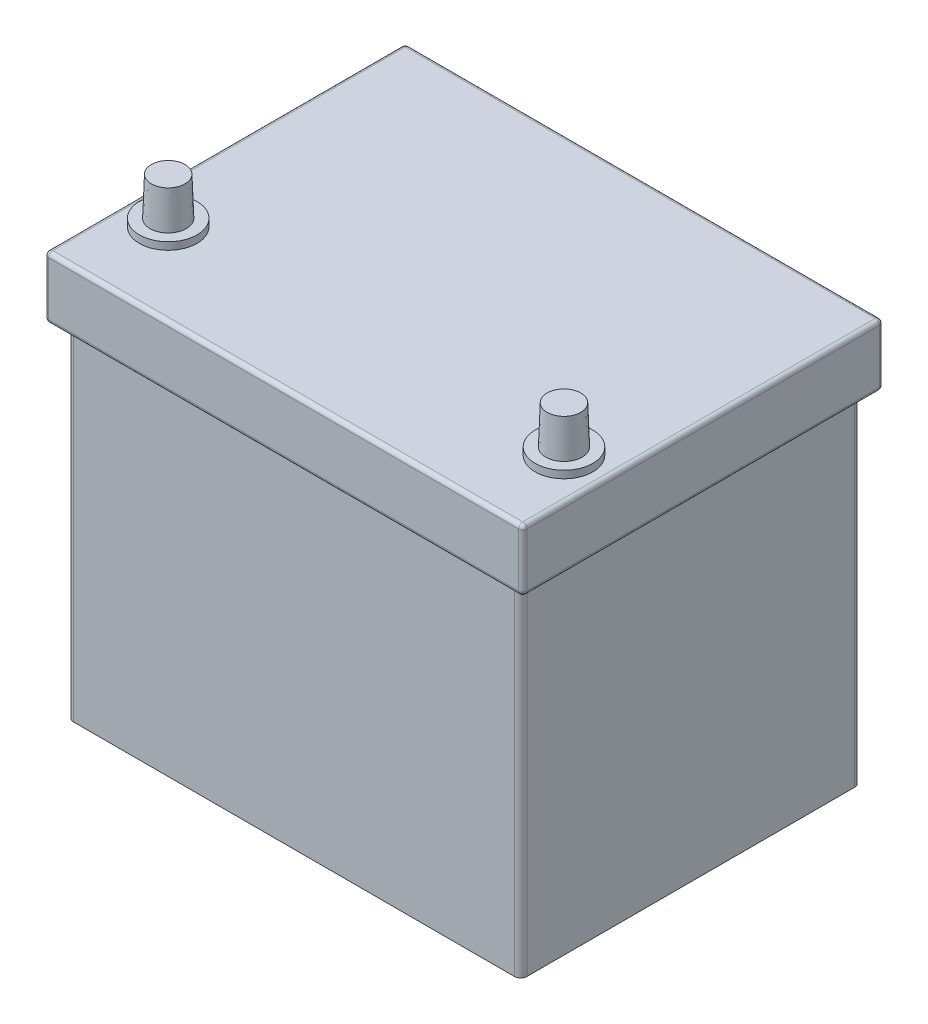
ISO-10303-21;
HEADER;
FILE_DESCRIPTION(('STEP AP214'),'2;1');
FILE_NAME('part.step','',(''),(''),'','','');
FILE_SCHEMA(('AUTOMOTIVE_DESIGN { 1 0 10303 214 1 1 1 1 }'));
ENDSEC;
DATA;
#1=APPLICATION_CONTEXT('core data for automotive mechanical design processes');
#2=APPLICATION_PROTOCOL_DEFINITION('international standard','automotive_design',2000,#1);
#3=PRODUCT_CONTEXT('',#1,'mechanical');
#4=PRODUCT('Part','Part','',(#3));
#5=PRODUCT_RELATED_PRODUCT_CATEGORY('part','',(#4));
#6=PRODUCT_DEFINITION_FORMATION('','',#4);
#7=PRODUCT_DEFINITION_CONTEXT('part definition',#1,'design');
#8=PRODUCT_DEFINITION('design','',#6,#7);
#9=PRODUCT_DEFINITION_SHAPE('','',#8);
#10=(LENGTH_UNIT() NAMED_UNIT(*) SI_UNIT(.MILLI.,.METRE.));
#11=(NAMED_UNIT(*) PLANE_ANGLE_UNIT() SI_UNIT($,.RADIAN.));
#12=(NAMED_UNIT(*) SI_UNIT($,.STERADIAN.) SOLID_ANGLE_UNIT());
#13=UNCERTAINTY_MEASURE_WITH_UNIT(LENGTH_MEASURE(1.E-05),#10,'distance_accuracy_value','');
#14=(GEOMETRIC_REPRESENTATION_CONTEXT(3) GLOBAL_UNCERTAINTY_ASSIGNED_CONTEXT((#13)) GLOBAL_UNIT_ASSIGNED_CONTEXT((#10,
#11,#12)) REPRESENTATION_CONTEXT('',''));
#15=CARTESIAN_POINT('',(0.,0.,0.));
#16=DIRECTION('',(0.,0.,1.));
#17=DIRECTION('',(1.,0.,0.));
#18=AXIS2_PLACEMENT_3D('',#15,#16,#17);
#19=CARTESIAN_POINT('',(-96.0000000000003,199.6,47.4999999999997));
#20=DIRECTION('',(0.,-1.,0.));
#21=DIRECTION('',(0.,0.,-1.));
#22=AXIS2_PLACEMENT_3D('',#19,#20,#21);
#23=PLANE('',#22);
#24=CARTESIAN_POINT('',(-96.0000000000003,199.6,47.4999999999997));
#25=DIRECTION('',(0.,1.,0.));
#26=DIRECTION('',(0.,0.,-1.));
#27=AXIS2_PLACEMENT_3D('',#24,#25,#26);
#28=CIRCLE('',#27,14.);
#29=CARTESIAN_POINT('',(-96.0000000000003,199.6,33.4999999999997));
#30=VERTEX_POINT('',#29);
#31=EDGE_CURVE('E389',#30,#30,#28,.T.);
#32=ORIENTED_EDGE('',*,*,#31,.T.);
#33=EDGE_LOOP('',(#32));
#34=FACE_BOUND('',#33,.T.);
#35=CARTESIAN_POINT('',(-96.0000000000003,199.6,47.4999999999997));
#36=DIRECTION('',(0.,-1.,0.));
#37=DIRECTION('',(0.,0.,-1.));
#38=AXIS2_PLACEMENT_3D('',#35,#36,#37);
#39=CIRCLE('',#38,8.80000000000001);
#40=CARTESIAN_POINT('',(-96.0000000000003,199.6,38.6999999999997));
#41=VERTEX_POINT('',#40);
#42=EDGE_CURVE('E12',#41,#41,#39,.F.);
#43=ORIENTED_EDGE('',*,*,#42,.F.);
#44=EDGE_LOOP('',(#43));
#45=FACE_BOUND('',#44,.T.);
#46=ADVANCED_FACE('F36',(#34,#45),#23,.F.);
#47=CARTESIAN_POINT('',(96.0000000000003,199.6,47.4999999999997));
#48=DIRECTION('',(0.,1.,0.));
#49=DIRECTION('',(0.,0.,1.));
#50=AXIS2_PLACEMENT_3D('',#47,#48,#49);
#51=PLANE('',#50);
#52=CARTESIAN_POINT('',(96.0000000000003,199.6,47.4999999999997));
#53=DIRECTION('',(0.,1.,0.));
#54=DIRECTION('',(0.,0.,1.));
#55=AXIS2_PLACEMENT_3D('',#52,#53,#54);
#56=CIRCLE('',#55,14.);
#57=CARTESIAN_POINT('',(96.0000000000003,199.6,61.4999999999997));
#58=VERTEX_POINT('',#57);
#59=EDGE_CURVE('E269',#58,#58,#56,.T.);
#60=ORIENTED_EDGE('',*,*,#59,.T.);
#61=EDGE_LOOP('',(#60));
#62=FACE_BOUND('',#61,.T.);
#63=CARTESIAN_POINT('',(96.0000000000003,199.6,47.4999999999997));
#64=DIRECTION('',(0.,1.,0.));
#65=DIRECTION('',(0.,0.,1.));
#66=AXIS2_PLACEMENT_3D('',#63,#64,#65);
#67=CIRCLE('',#66,8.80000000000001);
#68=CARTESIAN_POINT('',(96.0000000000003,199.6,56.2999999999997));
#69=VERTEX_POINT('',#68);
#70=EDGE_CURVE('E400',#69,#69,#67,.T.);
#71=ORIENTED_EDGE('',*,*,#70,.F.);
#72=EDGE_LOOP('',(#71));
#73=FACE_BOUND('',#72,.T.);
#74=ADVANCED_FACE('F417',(#62,#73),#51,.T.);
#75=CARTESIAN_POINT('',(116.,196.,87.4999999999997));
#76=DIRECTION('',(0.,1.,0.));
#77=DIRECTION('',(0.,0.,1.));
#78=AXIS2_PLACEMENT_3D('',#75,#76,#77);
#79=PLANE('',#78);
#80=CARTESIAN_POINT('',(96.0000000000003,196.,47.4999999999997));
#81=DIRECTION('',(0.,1.,0.));
#82=DIRECTION('',(0.,0.,1.));
#83=AXIS2_PLACEMENT_3D('',#80,#81,#82);
#84=CIRCLE('',#83,14.);
#85=CARTESIAN_POINT('',(96.0000000000003,196.,61.4999999999997));
#86=VERTEX_POINT('',#85);
#87=EDGE_CURVE('E386',#86,#86,#84,.T.);
#88=ORIENTED_EDGE('',*,*,#87,.F.);
#89=EDGE_LOOP('',(#88));
#90=FACE_BOUND('',#89,.T.);
#91=DIRECTION('',(0.,0.,1.));
#92=VECTOR('',#91,1.);
#93=CARTESIAN_POINT('',(-114.,196.,87.4999999999997));
#94=LINE('',#93,#92);
#95=CARTESIAN_POINT('',(-114.,196.,-85.5000000000005));
#96=VERTEX_POINT('',#95);
#97=CARTESIAN_POINT('',(-114.,196.,85.4999999999997));
#98=VERTEX_POINT('',#97);
#99=EDGE_CURVE('E238',#96,#98,#94,.T.);
#100=ORIENTED_EDGE('',*,*,#99,.T.);
#101=DIRECTION('',(1.,0.,0.));
#102=VECTOR('',#101,1.);
#103=CARTESIAN_POINT('',(116.,196.,85.4999999999997));
#104=LINE('',#103,#102);
#105=CARTESIAN_POINT('',(114.,196.,85.4999999999997));
#106=VERTEX_POINT('',#105);
#107=EDGE_CURVE('E240',#98,#106,#104,.T.);
#108=ORIENTED_EDGE('',*,*,#107,.T.);
#109=DIRECTION('',(0.,0.,-1.));
#110=VECTOR('',#109,1.);
#111=CARTESIAN_POINT('',(114.,196.,-87.5000000000005));
#112=LINE('',#111,#110);
#113=CARTESIAN_POINT('',(114.,196.,-85.5000000000005));
#114=VERTEX_POINT('',#113);
#115=EDGE_CURVE('E234',#106,#114,#112,.T.);
#116=ORIENTED_EDGE('',*,*,#115,.T.);
#117=DIRECTION('',(-1.,0.,0.));
#118=VECTOR('',#117,1.);
#119=CARTESIAN_POINT('',(-116.,196.,-85.5000000000005));
#120=LINE('',#119,#118);
#121=EDGE_CURVE('E236',#114,#96,#120,.T.);
#122=ORIENTED_EDGE('',*,*,#121,.T.);
#123=EDGE_LOOP('',(#100,#108,#116,#122));
#124=FACE_BOUND('',#123,.T.);
#125=CARTESIAN_POINT('',(-96.0000000000003,196.,47.4999999999997));
#126=DIRECTION('',(0.,1.,0.));
#127=DIRECTION('',(0.,0.,-1.));
#128=AXIS2_PLACEMENT_3D('',#125,#126,#127);
#129=CIRCLE('',#128,14.);
#130=CARTESIAN_POINT('',(-96.0000000000003,196.,33.4999999999997));
#131=VERTEX_POINT('',#130);
#132=EDGE_CURVE('E392',#131,#131,#129,.T.);
#133=ORIENTED_EDGE('',*,*,#132,.F.);
#134=EDGE_LOOP('',(#133));
#135=FACE_BOUND('',#134,.T.);
#136=ADVANCED_FACE('F423',(#90,#124,#135),#79,.T.);
#137=CARTESIAN_POINT('',(110.,166.,-82.5));
#138=DIRECTION('',(-1.,0.,0.));
#139=DIRECTION('',(0.,0.,1.));
#140=AXIS2_PLACEMENT_3D('',#137,#138,#139);
#141=PLANE('',#140);
#142=DIRECTION('',(0.,0.,-1.));
#143=VECTOR('',#142,1.);
#144=CARTESIAN_POINT('',(110.,0.,-82.5));
#145=LINE('',#144,#143);
#146=CARTESIAN_POINT('',(110.,0.,79.5));
#147=VERTEX_POINT('',#146);
#148=CARTESIAN_POINT('',(110.,0.,-79.5));
#149=VERTEX_POINT('',#148);
#150=EDGE_CURVE('E332',#147,#149,#145,.T.);
#151=ORIENTED_EDGE('',*,*,#150,.T.);
#152=DIRECTION('',(0.,-1.,0.));
#153=VECTOR('',#152,1.);
#154=CARTESIAN_POINT('',(110.,166.,-79.5));
#155=LINE('',#154,#153);
#156=CARTESIAN_POINT('',(110.,166.,-79.5));
#157=VERTEX_POINT('',#156);
#158=EDGE_CURVE('E184',#149,#157,#155,.F.);
#159=ORIENTED_EDGE('',*,*,#158,.T.);
#160=DIRECTION('',(0.,0.,-1.));
#161=VECTOR('',#160,1.);
#162=CARTESIAN_POINT('',(110.,166.,-82.5));
#163=LINE('',#162,#161);
#164=CARTESIAN_POINT('',(110.,166.,79.5));
#165=VERTEX_POINT('',#164);
#166=EDGE_CURVE('E352',#165,#157,#163,.T.);
#167=ORIENTED_EDGE('',*,*,#166,.F.);
#168=DIRECTION('',(0.,-1.,0.));
#169=VECTOR('',#168,1.);
#170=CARTESIAN_POINT('',(110.,166.,79.5));
#171=LINE('',#170,#169);
#172=EDGE_CURVE('E211',#165,#147,#171,.T.);
#173=ORIENTED_EDGE('',*,*,#172,.T.);
#174=EDGE_LOOP('',(#151,#159,#167,#173));
#175=FACE_BOUND('',#174,.T.);
#176=ADVANCED_FACE('F441',(#175),#141,.F.);
#177=CARTESIAN_POINT('',(-110.,166.,-82.5));
#178=DIRECTION('',(0.,0.,1.));
#179=DIRECTION('',(1.,0.,0.));
#180=AXIS2_PLACEMENT_3D('',#177,#178,#179);
#181=PLANE('',#180);
#182=DIRECTION('',(-1.,0.,0.));
#183=VECTOR('',#182,1.);
#184=CARTESIAN_POINT('',(-110.,0.,-82.5));
#185=LINE('',#184,#183);
#186=CARTESIAN_POINT('',(107.,0.,-82.5));
#187=VERTEX_POINT('',#186);
#188=CARTESIAN_POINT('',(-107.,0.,-82.5));
#189=VERTEX_POINT('',#188);
#190=EDGE_CURVE('E338',#187,#189,#185,.T.);
#191=ORIENTED_EDGE('',*,*,#190,.T.);
#192=DIRECTION('',(0.,-1.,0.));
#193=VECTOR('',#192,1.);
#194=CARTESIAN_POINT('',(-107.,166.,-82.5));
#195=LINE('',#194,#193);
#196=CARTESIAN_POINT('',(-107.,166.,-82.5));
#197=VERTEX_POINT('',#196);
#198=EDGE_CURVE('E200',#189,#197,#195,.F.);
#199=ORIENTED_EDGE('',*,*,#198,.T.);
#200=DIRECTION('',(-1.,0.,0.));
#201=VECTOR('',#200,1.);
#202=CARTESIAN_POINT('',(-110.,166.,-82.5));
#203=LINE('',#202,#201);
#204=CARTESIAN_POINT('',(107.,166.,-82.5));
#205=VERTEX_POINT('',#204);
#206=EDGE_CURVE('E370',#205,#197,#203,.T.);
#207=ORIENTED_EDGE('',*,*,#206,.F.);
#208=DIRECTION('',(0.,-1.,0.));
#209=VECTOR('',#208,1.);
#210=CARTESIAN_POINT('',(107.,166.,-82.5));
#211=LINE('',#210,#209);
#212=EDGE_CURVE('E204',#205,#187,#211,.T.);
#213=ORIENTED_EDGE('',*,*,#212,.T.);
#214=EDGE_LOOP('',(#191,#199,#207,#213));
#215=FACE_BOUND('',#214,.T.);
#216=ADVANCED_FACE('F367',(#215),#181,.F.);
#217=CARTESIAN_POINT('',(-110.,166.,-82.5));
#218=DIRECTION('',(1.,0.,0.));
#219=DIRECTION('',(0.,0.,-1.));
#220=AXIS2_PLACEMENT_3D('',#217,#218,#219);
#221=PLANE('',#220);
#222=DIRECTION('',(0.,0.,1.));
#223=VECTOR('',#222,1.);
#224=CARTESIAN_POINT('',(-110.,166.,-82.5));
#225=LINE('',#224,#223);
#226=CARTESIAN_POINT('',(-110.,166.,-79.5));
#227=VERTEX_POINT('',#226);
#228=CARTESIAN_POINT('',(-110.,166.,79.5));
#229=VERTEX_POINT('',#228);
#230=EDGE_CURVE('E194',#227,#229,#225,.T.);
#231=ORIENTED_EDGE('',*,*,#230,.F.);
#232=DIRECTION('',(0.,-1.,0.));
#233=VECTOR('',#232,1.);
#234=CARTESIAN_POINT('',(-110.,166.,-79.5));
#235=LINE('',#234,#233);
#236=CARTESIAN_POINT('',(-110.,0.,-79.5));
#237=VERTEX_POINT('',#236);
#238=EDGE_CURVE('E354',#227,#237,#235,.T.);
#239=ORIENTED_EDGE('',*,*,#238,.T.);
#240=DIRECTION('',(0.,0.,1.));
#241=VECTOR('',#240,1.);
#242=CARTESIAN_POINT('',(-110.,0.,-82.5));
#243=LINE('',#242,#241);
#244=CARTESIAN_POINT('',(-110.,0.,79.5));
#245=VERTEX_POINT('',#244);
#246=EDGE_CURVE('E344',#237,#245,#243,.T.);
#247=ORIENTED_EDGE('',*,*,#246,.T.);
#248=DIRECTION('',(0.,-1.,0.));
#249=VECTOR('',#248,1.);
#250=CARTESIAN_POINT('',(-110.,166.,79.5));
#251=LINE('',#250,#249);
#252=EDGE_CURVE('E193',#245,#229,#251,.F.);
#253=ORIENTED_EDGE('',*,*,#252,.T.);
#254=EDGE_LOOP('',(#231,#239,#247,#253));
#255=FACE_BOUND('',#254,.T.);
#256=ADVANCED_FACE('F381',(#255),#221,.F.);
#257=CARTESIAN_POINT('',(-110.,166.,82.5));
#258=DIRECTION('',(0.,0.,-1.));
#259=DIRECTION('',(-1.,0.,0.));
#260=AXIS2_PLACEMENT_3D('',#257,#258,#259);
#261=PLANE('',#260);
#262=DIRECTION('',(1.,0.,0.));
#263=VECTOR('',#262,1.);
#264=CARTESIAN_POINT('',(-110.,0.,82.5));
#265=LINE('',#264,#263);
#266=CARTESIAN_POINT('',(-107.,0.,82.5));
#267=VERTEX_POINT('',#266);
#268=CARTESIAN_POINT('',(107.,0.,82.5));
#269=VERTEX_POINT('',#268);
#270=EDGE_CURVE('E350',#267,#269,#265,.T.);
#271=ORIENTED_EDGE('',*,*,#270,.T.);
#272=DIRECTION('',(0.,-1.,0.));
#273=VECTOR('',#272,1.);
#274=CARTESIAN_POINT('',(107.,166.,82.5));
#275=LINE('',#274,#273);
#276=CARTESIAN_POINT('',(107.,166.,82.5));
#277=VERTEX_POINT('',#276);
#278=EDGE_CURVE('E183',#269,#277,#275,.F.);
#279=ORIENTED_EDGE('',*,*,#278,.T.);
#280=DIRECTION('',(1.,0.,0.));
#281=VECTOR('',#280,1.);
#282=CARTESIAN_POINT('',(-110.,166.,82.5));
#283=LINE('',#282,#281);
#284=CARTESIAN_POINT('',(-107.,166.,82.5));
#285=VERTEX_POINT('',#284);
#286=EDGE_CURVE('E187',#285,#277,#283,.T.);
#287=ORIENTED_EDGE('',*,*,#286,.F.);
#288=DIRECTION('',(0.,-1.,0.));
#289=VECTOR('',#288,1.);
#290=CARTESIAN_POINT('',(-107.,166.,82.5));
#291=LINE('',#290,#289);
#292=EDGE_CURVE('E172',#285,#267,#291,.T.);
#293=ORIENTED_EDGE('',*,*,#292,.T.);
#294=EDGE_LOOP('',(#271,#279,#287,#293));
#295=FACE_BOUND('',#294,.T.);
#296=ADVANCED_FACE('F188',(#295),#261,.F.);
#297=CARTESIAN_POINT('',(110.,0.,82.5));
#298=DIRECTION('',(0.,1.,0.));
#299=DIRECTION('',(0.,0.,1.));
#300=AXIS2_PLACEMENT_3D('',#297,#298,#299);
#301=PLANE('',#300);
#302=ORIENTED_EDGE('',*,*,#246,.F.);
#303=CARTESIAN_POINT('',(-107.,0.,-79.5));
#304=DIRECTION('',(0.,1.,0.));
#305=DIRECTION('',(0.,0.,1.));
#306=AXIS2_PLACEMENT_3D('',#303,#304,#305);
#307=CIRCLE('',#306,3.);
#308=EDGE_CURVE('E362',#237,#189,#307,.F.);
#309=ORIENTED_EDGE('',*,*,#308,.T.);
#310=ORIENTED_EDGE('',*,*,#190,.F.);
#311=CARTESIAN_POINT('',(107.,0.,-79.5));
#312=DIRECTION('',(0.,1.,0.));
#313=DIRECTION('',(0.,0.,1.));
#314=AXIS2_PLACEMENT_3D('',#311,#312,#313);
#315=CIRCLE('',#314,3.);
#316=EDGE_CURVE('E360',#187,#149,#315,.F.);
#317=ORIENTED_EDGE('',*,*,#316,.T.);
#318=ORIENTED_EDGE('',*,*,#150,.F.);
#319=CARTESIAN_POINT('',(107.,0.,79.5));
#320=DIRECTION('',(0.,1.,0.));
#321=DIRECTION('',(0.,0.,1.));
#322=AXIS2_PLACEMENT_3D('',#319,#320,#321);
#323=CIRCLE('',#322,3.);
#324=EDGE_CURVE('E358',#147,#269,#323,.F.);
#325=ORIENTED_EDGE('',*,*,#324,.T.);
#326=ORIENTED_EDGE('',*,*,#270,.F.);
#327=CARTESIAN_POINT('',(-107.,0.,79.5));
#328=DIRECTION('',(0.,1.,0.));
#329=DIRECTION('',(0.,0.,1.));
#330=AXIS2_PLACEMENT_3D('',#327,#328,#329);
#331=CIRCLE('',#330,3.);
#332=EDGE_CURVE('E179',#267,#245,#331,.F.);
#333=ORIENTED_EDGE('',*,*,#332,.T.);
#334=EDGE_LOOP('',(#302,#309,#310,#317,#318,#325,#326,#333));
#335=FACE_BOUND('',#334,.T.);
#336=ADVANCED_FACE('F375',(#335),#301,.F.);
#337=CARTESIAN_POINT('',(-107.,166.,-79.5));
#338=DIRECTION('',(0.,-1.,0.));
#339=DIRECTION('',(0.,0.,-1.));
#340=AXIS2_PLACEMENT_3D('',#337,#338,#339);
#341=CYLINDRICAL_SURFACE('',#340,3.);
#342=CARTESIAN_POINT('',(-107.,166.,-79.5));
#343=DIRECTION('',(0.,1.,0.));
#344=DIRECTION('',(0.,0.,1.));
#345=AXIS2_PLACEMENT_3D('',#342,#343,#344);
#346=CIRCLE('',#345,3.);
#347=EDGE_CURVE('E209',#197,#227,#346,.T.);
#348=ORIENTED_EDGE('',*,*,#347,.F.);
#349=ORIENTED_EDGE('',*,*,#198,.F.);
#350=ORIENTED_EDGE('',*,*,#308,.F.);
#351=ORIENTED_EDGE('',*,*,#238,.F.);
#352=EDGE_LOOP('',(#348,#349,#350,#351));
#353=FACE_BOUND('',#352,.T.);
#354=ADVANCED_FACE('F379',(#353),#341,.T.);
#355=CARTESIAN_POINT('',(107.,166.,-79.5));
#356=DIRECTION('',(0.,-1.,0.));
#357=DIRECTION('',(0.,0.,-1.));
#358=AXIS2_PLACEMENT_3D('',#355,#356,#357);
#359=CYLINDRICAL_SURFACE('',#358,3.);
#360=CARTESIAN_POINT('',(107.,166.,-79.5));
#361=DIRECTION('',(0.,1.,0.));
#362=DIRECTION('',(0.,0.,1.));
#363=AXIS2_PLACEMENT_3D('',#360,#361,#362);
#364=CIRCLE('',#363,3.);
#365=EDGE_CURVE('E202',#157,#205,#364,.T.);
#366=ORIENTED_EDGE('',*,*,#365,.F.);
#367=ORIENTED_EDGE('',*,*,#158,.F.);
#368=ORIENTED_EDGE('',*,*,#316,.F.);
#369=ORIENTED_EDGE('',*,*,#212,.F.);
#370=EDGE_LOOP('',(#366,#367,#368,#369));
#371=FACE_BOUND('',#370,.T.);
#372=ADVANCED_FACE('F473',(#371),#359,.T.);
#373=CARTESIAN_POINT('',(107.,166.,79.5));
#374=DIRECTION('',(0.,-1.,0.));
#375=DIRECTION('',(0.,0.,-1.));
#376=AXIS2_PLACEMENT_3D('',#373,#374,#375);
#377=CYLINDRICAL_SURFACE('',#376,3.);
#378=CARTESIAN_POINT('',(107.,166.,79.5));
#379=DIRECTION('',(0.,1.,0.));
#380=DIRECTION('',(0.,0.,1.));
#381=AXIS2_PLACEMENT_3D('',#378,#379,#380);
#382=CIRCLE('',#381,3.);
#383=EDGE_CURVE('E199',#277,#165,#382,.T.);
#384=ORIENTED_EDGE('',*,*,#383,.F.);
#385=ORIENTED_EDGE('',*,*,#278,.F.);
#386=ORIENTED_EDGE('',*,*,#324,.F.);
#387=ORIENTED_EDGE('',*,*,#172,.F.);
#388=EDGE_LOOP('',(#384,#385,#386,#387));
#389=FACE_BOUND('',#388,.T.);
#390=ADVANCED_FACE('F476',(#389),#377,.T.);
#391=CARTESIAN_POINT('',(-107.,166.,79.5));
#392=DIRECTION('',(0.,-1.,0.));
#393=DIRECTION('',(0.,0.,-1.));
#394=AXIS2_PLACEMENT_3D('',#391,#392,#393);
#395=CYLINDRICAL_SURFACE('',#394,3.);
#396=CARTESIAN_POINT('',(-107.,166.,79.5));
#397=DIRECTION('',(0.,1.,0.));
#398=DIRECTION('',(0.,0.,1.));
#399=AXIS2_PLACEMENT_3D('',#396,#397,#398);
#400=CIRCLE('',#399,3.);
#401=EDGE_CURVE('E177',#229,#285,#400,.T.);
#402=ORIENTED_EDGE('',*,*,#401,.F.);
#403=ORIENTED_EDGE('',*,*,#252,.F.);
#404=ORIENTED_EDGE('',*,*,#332,.F.);
#405=ORIENTED_EDGE('',*,*,#292,.F.);
#406=EDGE_LOOP('',(#402,#403,#404,#405));
#407=FACE_BOUND('',#406,.T.);
#408=ADVANCED_FACE('F174',(#407),#395,.T.);
#409=CARTESIAN_POINT('',(116.,196.,-87.5000000000005));
#410=DIRECTION('',(-1.,0.,0.));
#411=DIRECTION('',(0.,0.,1.));
#412=AXIS2_PLACEMENT_3D('',#409,#410,#411);
#413=PLANE('',#412);
#414=DIRECTION('',(0.,0.,-1.));
#415=VECTOR('',#414,1.);
#416=CARTESIAN_POINT('',(116.,194.,87.4999999999997));
#417=LINE('',#416,#415);
#418=CARTESIAN_POINT('',(116.,194.,-85.5000000000005));
#419=VERTEX_POINT('',#418);
#420=CARTESIAN_POINT('',(116.,194.,85.4999999999997));
#421=VERTEX_POINT('',#420);
#422=EDGE_CURVE('E220',#419,#421,#417,.F.);
#423=ORIENTED_EDGE('',*,*,#422,.T.);
#424=DIRECTION('',(0.,-1.,0.));
#425=VECTOR('',#424,1.);
#426=CARTESIAN_POINT('',(116.,196.,85.4999999999997));
#427=LINE('',#426,#425);
#428=CARTESIAN_POINT('',(116.,168.,85.4999999999997));
#429=VERTEX_POINT('',#428);
#430=EDGE_CURVE('E222',#421,#429,#427,.T.);
#431=ORIENTED_EDGE('',*,*,#430,.T.);
#432=DIRECTION('',(0.,0.,-1.));
#433=VECTOR('',#432,1.);
#434=CARTESIAN_POINT('',(116.,168.,-87.5000000000005));
#435=LINE('',#434,#433);
#436=CARTESIAN_POINT('',(116.,168.,-85.5000000000005));
#437=VERTEX_POINT('',#436);
#438=EDGE_CURVE('E216',#429,#437,#435,.T.);
#439=ORIENTED_EDGE('',*,*,#438,.T.);
#440=DIRECTION('',(0.,-1.,0.));
#441=VECTOR('',#440,1.);
#442=CARTESIAN_POINT('',(116.,196.,-85.5000000000005));
#443=LINE('',#442,#441);
#444=EDGE_CURVE('E218',#437,#419,#443,.F.);
#445=ORIENTED_EDGE('',*,*,#444,.T.);
#446=EDGE_LOOP('',(#423,#431,#439,#445));
#447=FACE_BOUND('',#446,.T.);
#448=ADVANCED_FACE('F456',(#447),#413,.F.);
#449=CARTESIAN_POINT('',(-116.,196.,-87.5000000000005));
#450=DIRECTION('',(0.,0.,1.));
#451=DIRECTION('',(1.,0.,0.));
#452=AXIS2_PLACEMENT_3D('',#449,#450,#451);
#453=PLANE('',#452);
#454=DIRECTION('',(-1.,0.,0.));
#455=VECTOR('',#454,1.);
#456=CARTESIAN_POINT('',(-116.,168.,-87.5000000000005));
#457=LINE('',#456,#455);
#458=CARTESIAN_POINT('',(114.,168.,-87.5000000000005));
#459=VERTEX_POINT('',#458);
#460=CARTESIAN_POINT('',(-114.,168.,-87.5000000000005));
#461=VERTEX_POINT('',#460);
#462=EDGE_CURVE('E252',#459,#461,#457,.T.);
#463=ORIENTED_EDGE('',*,*,#462,.T.);
#464=DIRECTION('',(0.,-1.,0.));
#465=VECTOR('',#464,1.);
#466=CARTESIAN_POINT('',(-114.,196.,-87.5000000000005));
#467=LINE('',#466,#465);
#468=CARTESIAN_POINT('',(-114.,194.,-87.5000000000005));
#469=VERTEX_POINT('',#468);
#470=EDGE_CURVE('E258',#461,#469,#467,.F.);
#471=ORIENTED_EDGE('',*,*,#470,.T.);
#472=DIRECTION('',(-1.,0.,0.));
#473=VECTOR('',#472,1.);
#474=CARTESIAN_POINT('',(116.,194.,-87.5000000000005));
#475=LINE('',#474,#473);
#476=CARTESIAN_POINT('',(114.,194.,-87.5000000000005));
#477=VERTEX_POINT('',#476);
#478=EDGE_CURVE('E256',#469,#477,#475,.F.);
#479=ORIENTED_EDGE('',*,*,#478,.T.);
#480=DIRECTION('',(0.,-1.,0.));
#481=VECTOR('',#480,1.);
#482=CARTESIAN_POINT('',(114.,196.,-87.5000000000005));
#483=LINE('',#482,#481);
#484=EDGE_CURVE('E254',#477,#459,#483,.T.);
#485=ORIENTED_EDGE('',*,*,#484,.T.);
#486=EDGE_LOOP('',(#463,#471,#479,#485));
#487=FACE_BOUND('',#486,.T.);
#488=ADVANCED_FACE('F452',(#487),#453,.F.);
#489=CARTESIAN_POINT('',(-116.,196.,-87.5000000000005));
#490=DIRECTION('',(1.,0.,0.));
#491=DIRECTION('',(0.,0.,-1.));
#492=AXIS2_PLACEMENT_3D('',#489,#490,#491);
#493=PLANE('',#492);
#494=DIRECTION('',(0.,0.,1.));
#495=VECTOR('',#494,1.);
#496=CARTESIAN_POINT('',(-116.,168.,-87.5000000000005));
#497=LINE('',#496,#495);
#498=CARTESIAN_POINT('',(-116.,168.,-85.5000000000005));
#499=VERTEX_POINT('',#498);
#500=CARTESIAN_POINT('',(-116.,168.,85.4999999999997));
#501=VERTEX_POINT('',#500);
#502=EDGE_CURVE('E243',#499,#501,#497,.T.);
#503=ORIENTED_EDGE('',*,*,#502,.T.);
#504=DIRECTION('',(0.,-1.,0.));
#505=VECTOR('',#504,1.);
#506=CARTESIAN_POINT('',(-116.,196.,85.4999999999997));
#507=LINE('',#506,#505);
#508=CARTESIAN_POINT('',(-116.,194.,85.4999999999997));
#509=VERTEX_POINT('',#508);
#510=EDGE_CURVE('E249',#501,#509,#507,.F.);
#511=ORIENTED_EDGE('',*,*,#510,.T.);
#512=DIRECTION('',(0.,0.,1.));
#513=VECTOR('',#512,1.);
#514=CARTESIAN_POINT('',(-116.,194.,-87.5000000000005));
#515=LINE('',#514,#513);
#516=CARTESIAN_POINT('',(-116.,194.,-85.5000000000005));
#517=VERTEX_POINT('',#516);
#518=EDGE_CURVE('E247',#509,#517,#515,.F.);
#519=ORIENTED_EDGE('',*,*,#518,.T.);
#520=DIRECTION('',(0.,-1.,0.));
#521=VECTOR('',#520,1.);
#522=CARTESIAN_POINT('',(-116.,196.,-85.5000000000005));
#523=LINE('',#522,#521);
#524=EDGE_CURVE('E245',#517,#499,#523,.T.);
#525=ORIENTED_EDGE('',*,*,#524,.T.);
#526=EDGE_LOOP('',(#503,#511,#519,#525));
#527=FACE_BOUND('',#526,.T.);
#528=ADVANCED_FACE('F448',(#527),#493,.F.);
#529=CARTESIAN_POINT('',(-116.,196.,87.4999999999997));
#530=DIRECTION('',(0.,0.,-1.));
#531=DIRECTION('',(-1.,0.,0.));
#532=AXIS2_PLACEMENT_3D('',#529,#530,#531);
#533=PLANE('',#532);
#534=DIRECTION('',(1.,0.,0.));
#535=VECTOR('',#534,1.);
#536=CARTESIAN_POINT('',(-116.,168.,87.4999999999997));
#537=LINE('',#536,#535);
#538=CARTESIAN_POINT('',(-114.,168.,87.4999999999997));
#539=VERTEX_POINT('',#538);
#540=CARTESIAN_POINT('',(114.,168.,87.4999999999997));
#541=VERTEX_POINT('',#540);
#542=EDGE_CURVE('E225',#539,#541,#537,.T.);
#543=ORIENTED_EDGE('',*,*,#542,.T.);
#544=DIRECTION('',(0.,-1.,0.));
#545=VECTOR('',#544,1.);
#546=CARTESIAN_POINT('',(114.,196.,87.4999999999997));
#547=LINE('',#546,#545);
#548=CARTESIAN_POINT('',(114.,194.,87.4999999999997));
#549=VERTEX_POINT('',#548);
#550=EDGE_CURVE('E231',#541,#549,#547,.F.);
#551=ORIENTED_EDGE('',*,*,#550,.T.);
#552=DIRECTION('',(1.,0.,0.));
#553=VECTOR('',#552,1.);
#554=CARTESIAN_POINT('',(-116.,194.,87.4999999999997));
#555=LINE('',#554,#553);
#556=CARTESIAN_POINT('',(-114.,194.,87.4999999999997));
#557=VERTEX_POINT('',#556);
#558=EDGE_CURVE('E229',#549,#557,#555,.F.);
#559=ORIENTED_EDGE('',*,*,#558,.T.);
#560=DIRECTION('',(0.,-1.,0.));
#561=VECTOR('',#560,1.);
#562=CARTESIAN_POINT('',(-114.,196.,87.4999999999997));
#563=LINE('',#562,#561);
#564=EDGE_CURVE('E227',#557,#539,#563,.T.);
#565=ORIENTED_EDGE('',*,*,#564,.T.);
#566=EDGE_LOOP('',(#543,#551,#559,#565));
#567=FACE_BOUND('',#566,.T.);
#568=ADVANCED_FACE('F445',(#567),#533,.F.);
#569=CARTESIAN_POINT('',(116.,166.,87.4999999999997));
#570=DIRECTION('',(0.,1.,0.));
#571=DIRECTION('',(0.,0.,1.));
#572=AXIS2_PLACEMENT_3D('',#569,#570,#571);
#573=PLANE('',#572);
#574=DIRECTION('',(0.,0.,1.));
#575=VECTOR('',#574,1.);
#576=CARTESIAN_POINT('',(-114.,166.,87.4999999999997));
#577=LINE('',#576,#575);
#578=CARTESIAN_POINT('',(-114.,166.,85.4999999999997));
#579=VERTEX_POINT('',#578);
#580=CARTESIAN_POINT('',(-114.,166.,-85.5000000000005));
#581=VERTEX_POINT('',#580);
#582=EDGE_CURVE('E51',#579,#581,#577,.F.);
#583=ORIENTED_EDGE('',*,*,#582,.T.);
#584=DIRECTION('',(-1.,0.,0.));
#585=VECTOR('',#584,1.);
#586=CARTESIAN_POINT('',(116.,166.,-85.5000000000005));
#587=LINE('',#586,#585);
#588=CARTESIAN_POINT('',(114.,166.,-85.5000000000005));
#589=VERTEX_POINT('',#588);
#590=EDGE_CURVE('E44',#581,#589,#587,.F.);
#591=ORIENTED_EDGE('',*,*,#590,.T.);
#592=DIRECTION('',(0.,0.,-1.));
#593=VECTOR('',#592,1.);
#594=CARTESIAN_POINT('',(114.,166.,87.4999999999997));
#595=LINE('',#594,#593);
#596=CARTESIAN_POINT('',(114.,166.,85.4999999999997));
#597=VERTEX_POINT('',#596);
#598=EDGE_CURVE('E261',#589,#597,#595,.F.);
#599=ORIENTED_EDGE('',*,*,#598,.T.);
#600=DIRECTION('',(1.,0.,0.));
#601=VECTOR('',#600,1.);
#602=CARTESIAN_POINT('',(116.,166.,85.4999999999997));
#603=LINE('',#602,#601);
#604=EDGE_CURVE('E56',#597,#579,#603,.F.);
#605=ORIENTED_EDGE('',*,*,#604,.T.);
#606=EDGE_LOOP('',(#583,#591,#599,#605));
#607=FACE_BOUND('',#606,.T.);
#608=ORIENTED_EDGE('',*,*,#365,.T.);
#609=ORIENTED_EDGE('',*,*,#206,.T.);
#610=ORIENTED_EDGE('',*,*,#347,.T.);
#611=ORIENTED_EDGE('',*,*,#230,.T.);
#612=ORIENTED_EDGE('',*,*,#401,.T.);
#613=ORIENTED_EDGE('',*,*,#286,.T.);
#614=ORIENTED_EDGE('',*,*,#383,.T.);
#615=ORIENTED_EDGE('',*,*,#166,.T.);
#616=EDGE_LOOP('',(#608,#609,#610,#611,#612,#613,#614,#615));
#617=FACE_BOUND('',#616,.T.);
#618=ADVANCED_FACE('F197',(#607,#617),#573,.F.);
#619=CARTESIAN_POINT('',(-114.,196.,-85.5000000000005));
#620=DIRECTION('',(0.,-1.,0.));
#621=DIRECTION('',(0.,0.,-1.));
#622=AXIS2_PLACEMENT_3D('',#619,#620,#621);
#623=CYLINDRICAL_SURFACE('',#622,2.);
#624=CARTESIAN_POINT('',(-114.,194.,-85.5000000000005));
#625=DIRECTION('',(0.,1.,0.));
#626=DIRECTION('',(0.,0.,1.));
#627=AXIS2_PLACEMENT_3D('',#624,#625,#626);
#628=CIRCLE('',#627,2.);
#629=EDGE_CURVE('E330',#469,#517,#628,.T.);
#630=ORIENTED_EDGE('',*,*,#629,.F.);
#631=ORIENTED_EDGE('',*,*,#470,.F.);
#632=CARTESIAN_POINT('',(-114.,168.,-85.5000000000005));
#633=DIRECTION('',(0.,-1.,0.));
#634=DIRECTION('',(0.,0.,-1.));
#635=AXIS2_PLACEMENT_3D('',#632,#633,#634);
#636=CIRCLE('',#635,2.);
#637=EDGE_CURVE('E328',#499,#461,#636,.T.);
#638=ORIENTED_EDGE('',*,*,#637,.F.);
#639=ORIENTED_EDGE('',*,*,#524,.F.);
#640=EDGE_LOOP('',(#630,#631,#638,#639));
#641=FACE_BOUND('',#640,.T.);
#642=ADVANCED_FACE('F38',(#641),#623,.T.);
#643=CARTESIAN_POINT('',(-114.,194.,-85.5000000000005));
#644=DIRECTION('',(0.,0.,1.));
#645=DIRECTION('',(1.,0.,0.));
#646=AXIS2_PLACEMENT_3D('',#643,#644,#645);
#647=SPHERICAL_SURFACE('',#646,2.);
#648=CARTESIAN_POINT('',(-114.,194.,-85.5000000000005));
#649=DIRECTION('',(-1.,0.,0.));
#650=DIRECTION('',(0.,0.,1.));
#651=AXIS2_PLACEMENT_3D('',#648,#649,#650);
#652=CIRCLE('',#651,2.);
#653=EDGE_CURVE('E322',#469,#96,#652,.F.);
#654=ORIENTED_EDGE('',*,*,#653,.F.);
#655=ORIENTED_EDGE('',*,*,#629,.T.);
#656=CARTESIAN_POINT('',(-114.,194.,-85.5000000000005));
#657=DIRECTION('',(0.,0.,-1.));
#658=DIRECTION('',(-1.,0.,0.));
#659=AXIS2_PLACEMENT_3D('',#656,#657,#658);
#660=CIRCLE('',#659,2.);
#661=EDGE_CURVE('E325',#96,#517,#660,.F.);
#662=ORIENTED_EDGE('',*,*,#661,.F.);
#663=EDGE_LOOP('',(#654,#655,#662));
#664=FACE_BOUND('',#663,.T.);
#665=ADVANCED_FACE('F551',(#664),#647,.T.);
#666=CARTESIAN_POINT('',(-114.,168.,-85.5000000000005));
#667=DIRECTION('',(0.,0.,1.));
#668=DIRECTION('',(1.,0.,0.));
#669=AXIS2_PLACEMENT_3D('',#666,#667,#668);
#670=SPHERICAL_SURFACE('',#669,2.);
#671=CARTESIAN_POINT('',(-114.,168.,-85.5000000000005));
#672=DIRECTION('',(0.,0.,-1.));
#673=DIRECTION('',(-1.,0.,0.));
#674=AXIS2_PLACEMENT_3D('',#671,#672,#673);
#675=CIRCLE('',#674,2.);
#676=EDGE_CURVE('E317',#499,#581,#675,.F.);
#677=ORIENTED_EDGE('',*,*,#676,.F.);
#678=ORIENTED_EDGE('',*,*,#637,.T.);
#679=CARTESIAN_POINT('',(-114.,168.,-85.5000000000005));
#680=DIRECTION('',(-1.,0.,0.));
#681=DIRECTION('',(0.,0.,1.));
#682=AXIS2_PLACEMENT_3D('',#679,#680,#681);
#683=CIRCLE('',#682,2.);
#684=EDGE_CURVE('E319',#581,#461,#683,.F.);
#685=ORIENTED_EDGE('',*,*,#684,.F.);
#686=EDGE_LOOP('',(#677,#678,#685));
#687=FACE_BOUND('',#686,.T.);
#688=ADVANCED_FACE('F548',(#687),#670,.T.);
#689=CARTESIAN_POINT('',(-114.,194.,87.4999999999997));
#690=DIRECTION('',(0.,0.,-1.));
#691=DIRECTION('',(-1.,0.,0.));
#692=AXIS2_PLACEMENT_3D('',#689,#690,#691);
#693=CYLINDRICAL_SURFACE('',#692,2.);
#694=ORIENTED_EDGE('',*,*,#661,.T.);
#695=ORIENTED_EDGE('',*,*,#518,.F.);
#696=CARTESIAN_POINT('',(-114.,194.,85.4999999999997));
#697=DIRECTION('',(0.,0.,1.));
#698=DIRECTION('',(1.,0.,0.));
#699=AXIS2_PLACEMENT_3D('',#696,#697,#698);
#700=CIRCLE('',#699,2.);
#701=EDGE_CURVE('E312',#98,#509,#700,.T.);
#702=ORIENTED_EDGE('',*,*,#701,.F.);
#703=ORIENTED_EDGE('',*,*,#99,.F.);
#704=EDGE_LOOP('',(#694,#695,#702,#703));
#705=FACE_BOUND('',#704,.T.);
#706=ADVANCED_FACE('F544',(#705),#693,.T.);
#707=CARTESIAN_POINT('',(116.,194.,-85.5000000000005));
#708=DIRECTION('',(1.,0.,0.));
#709=DIRECTION('',(0.,0.,-1.));
#710=AXIS2_PLACEMENT_3D('',#707,#708,#709);
#711=CYLINDRICAL_SURFACE('',#710,2.);
#712=ORIENTED_EDGE('',*,*,#653,.T.);
#713=ORIENTED_EDGE('',*,*,#121,.F.);
#714=CARTESIAN_POINT('',(114.,194.,-85.5000000000005));
#715=DIRECTION('',(1.,0.,0.));
#716=DIRECTION('',(0.,0.,-1.));
#717=AXIS2_PLACEMENT_3D('',#714,#715,#716);
#718=CIRCLE('',#717,2.);
#719=EDGE_CURVE('E309',#477,#114,#718,.T.);
#720=ORIENTED_EDGE('',*,*,#719,.F.);
#721=ORIENTED_EDGE('',*,*,#478,.F.);
#722=EDGE_LOOP('',(#712,#713,#720,#721));
#723=FACE_BOUND('',#722,.T.);
#724=ADVANCED_FACE('F540',(#723),#711,.T.);
#725=CARTESIAN_POINT('',(114.,196.,-85.5000000000005));
#726=DIRECTION('',(0.,-1.,0.));
#727=DIRECTION('',(0.,0.,-1.));
#728=AXIS2_PLACEMENT_3D('',#725,#726,#727);
#729=CYLINDRICAL_SURFACE('',#728,2.);
#730=CARTESIAN_POINT('',(114.,168.,-85.5000000000005));
#731=DIRECTION('',(0.,-1.,0.));
#732=DIRECTION('',(0.,0.,-1.));
#733=AXIS2_PLACEMENT_3D('',#730,#731,#732);
#734=CIRCLE('',#733,2.);
#735=EDGE_CURVE('E303',#459,#437,#734,.T.);
#736=ORIENTED_EDGE('',*,*,#735,.F.);
#737=ORIENTED_EDGE('',*,*,#484,.F.);
#738=CARTESIAN_POINT('',(114.,194.,-85.5000000000005));
#739=DIRECTION('',(0.,1.,0.));
#740=DIRECTION('',(0.,0.,1.));
#741=AXIS2_PLACEMENT_3D('',#738,#739,#740);
#742=CIRCLE('',#741,2.);
#743=EDGE_CURVE('E306',#419,#477,#742,.T.);
#744=ORIENTED_EDGE('',*,*,#743,.F.);
#745=ORIENTED_EDGE('',*,*,#444,.F.);
#746=EDGE_LOOP('',(#736,#737,#744,#745));
#747=FACE_BOUND('',#746,.T.);
#748=ADVANCED_FACE('F536',(#747),#729,.T.);
#749=CARTESIAN_POINT('',(-116.,168.,-85.5000000000005));
#750=DIRECTION('',(-1.,0.,0.));
#751=DIRECTION('',(0.,0.,1.));
#752=AXIS2_PLACEMENT_3D('',#749,#750,#751);
#753=CYLINDRICAL_SURFACE('',#752,2.);
#754=ORIENTED_EDGE('',*,*,#684,.T.);
#755=ORIENTED_EDGE('',*,*,#462,.F.);
#756=CARTESIAN_POINT('',(114.,168.,-85.5000000000005));
#757=DIRECTION('',(1.,0.,0.));
#758=DIRECTION('',(0.,0.,-1.));
#759=AXIS2_PLACEMENT_3D('',#756,#757,#758);
#760=CIRCLE('',#759,2.);
#761=EDGE_CURVE('E300',#589,#459,#760,.T.);
#762=ORIENTED_EDGE('',*,*,#761,.F.);
#763=ORIENTED_EDGE('',*,*,#590,.F.);
#764=EDGE_LOOP('',(#754,#755,#762,#763));
#765=FACE_BOUND('',#764,.T.);
#766=ADVANCED_FACE('F532',(#765),#753,.T.);
#767=CARTESIAN_POINT('',(-114.,168.,-87.5000000000005));
#768=DIRECTION('',(0.,0.,1.));
#769=DIRECTION('',(1.,0.,0.));
#770=AXIS2_PLACEMENT_3D('',#767,#768,#769);
#771=CYLINDRICAL_SURFACE('',#770,2.);
#772=ORIENTED_EDGE('',*,*,#676,.T.);
#773=ORIENTED_EDGE('',*,*,#582,.F.);
#774=CARTESIAN_POINT('',(-114.,168.,85.4999999999997));
#775=DIRECTION('',(0.,0.,1.));
#776=DIRECTION('',(1.,0.,0.));
#777=AXIS2_PLACEMENT_3D('',#774,#775,#776);
#778=CIRCLE('',#777,2.);
#779=EDGE_CURVE('E297',#501,#579,#778,.T.);
#780=ORIENTED_EDGE('',*,*,#779,.F.);
#781=ORIENTED_EDGE('',*,*,#502,.F.);
#782=EDGE_LOOP('',(#772,#773,#780,#781));
#783=FACE_BOUND('',#782,.T.);
#784=ADVANCED_FACE('F528',(#783),#771,.T.);
#785=CARTESIAN_POINT('',(-114.,196.,85.4999999999997));
#786=DIRECTION('',(0.,-1.,0.));
#787=DIRECTION('',(0.,0.,-1.));
#788=AXIS2_PLACEMENT_3D('',#785,#786,#787);
#789=CYLINDRICAL_SURFACE('',#788,2.);
#790=CARTESIAN_POINT('',(-114.,194.,85.4999999999997));
#791=DIRECTION('',(0.,1.,0.));
#792=DIRECTION('',(0.,0.,1.));
#793=AXIS2_PLACEMENT_3D('',#790,#791,#792);
#794=CIRCLE('',#793,2.);
#795=EDGE_CURVE('E314',#509,#557,#794,.T.);
#796=ORIENTED_EDGE('',*,*,#795,.F.);
#797=ORIENTED_EDGE('',*,*,#510,.F.);
#798=CARTESIAN_POINT('',(-114.,168.,85.4999999999997));
#799=DIRECTION('',(0.,-1.,0.));
#800=DIRECTION('',(0.,0.,-1.));
#801=AXIS2_PLACEMENT_3D('',#798,#799,#800);
#802=CIRCLE('',#801,2.);
#803=EDGE_CURVE('E294',#539,#501,#802,.T.);
#804=ORIENTED_EDGE('',*,*,#803,.F.);
#805=ORIENTED_EDGE('',*,*,#564,.F.);
#806=EDGE_LOOP('',(#796,#797,#804,#805));
#807=FACE_BOUND('',#806,.T.);
#808=ADVANCED_FACE('F524',(#807),#789,.T.);
#809=CARTESIAN_POINT('',(-114.,194.,85.4999999999997));
#810=DIRECTION('',(0.,0.,1.));
#811=DIRECTION('',(1.,0.,0.));
#812=AXIS2_PLACEMENT_3D('',#809,#810,#811);
#813=SPHERICAL_SURFACE('',#812,2.);
#814=ORIENTED_EDGE('',*,*,#701,.T.);
#815=ORIENTED_EDGE('',*,*,#795,.T.);
#816=CARTESIAN_POINT('',(-114.,194.,85.4999999999997));
#817=DIRECTION('',(-1.,0.,0.));
#818=DIRECTION('',(0.,0.,1.));
#819=AXIS2_PLACEMENT_3D('',#816,#817,#818);
#820=CIRCLE('',#819,2.);
#821=EDGE_CURVE('E291',#98,#557,#820,.F.);
#822=ORIENTED_EDGE('',*,*,#821,.F.);
#823=EDGE_LOOP('',(#814,#815,#822));
#824=FACE_BOUND('',#823,.T.);
#825=ADVANCED_FACE('F520',(#824),#813,.T.);
#826=CARTESIAN_POINT('',(114.,194.,-85.5000000000005));
#827=DIRECTION('',(0.,0.,1.));
#828=DIRECTION('',(1.,0.,0.));
#829=AXIS2_PLACEMENT_3D('',#826,#827,#828);
#830=SPHERICAL_SURFACE('',#829,2.);
#831=ORIENTED_EDGE('',*,*,#743,.T.);
#832=ORIENTED_EDGE('',*,*,#719,.T.);
#833=CARTESIAN_POINT('',(114.,194.,-85.5000000000005));
#834=DIRECTION('',(0.,0.,-1.));
#835=DIRECTION('',(-1.,0.,0.));
#836=AXIS2_PLACEMENT_3D('',#833,#834,#835);
#837=CIRCLE('',#836,2.);
#838=EDGE_CURVE('E288',#419,#114,#837,.F.);
#839=ORIENTED_EDGE('',*,*,#838,.F.);
#840=EDGE_LOOP('',(#831,#832,#839));
#841=FACE_BOUND('',#840,.T.);
#842=ADVANCED_FACE('F516',(#841),#830,.T.);
#843=CARTESIAN_POINT('',(114.,168.,-85.5000000000005));
#844=DIRECTION('',(0.,0.,1.));
#845=DIRECTION('',(1.,0.,0.));
#846=AXIS2_PLACEMENT_3D('',#843,#844,#845);
#847=SPHERICAL_SURFACE('',#846,2.);
#848=ORIENTED_EDGE('',*,*,#761,.T.);
#849=ORIENTED_EDGE('',*,*,#735,.T.);
#850=CARTESIAN_POINT('',(114.,168.,-85.5000000000005));
#851=DIRECTION('',(0.,0.,-1.));
#852=DIRECTION('',(-1.,0.,0.));
#853=AXIS2_PLACEMENT_3D('',#850,#851,#852);
#854=CIRCLE('',#853,2.);
#855=EDGE_CURVE('E285',#589,#437,#854,.F.);
#856=ORIENTED_EDGE('',*,*,#855,.F.);
#857=EDGE_LOOP('',(#848,#849,#856));
#858=FACE_BOUND('',#857,.T.);
#859=ADVANCED_FACE('F512',(#858),#847,.T.);
#860=CARTESIAN_POINT('',(-114.,168.,85.4999999999997));
#861=DIRECTION('',(0.,0.,1.));
#862=DIRECTION('',(1.,0.,0.));
#863=AXIS2_PLACEMENT_3D('',#860,#861,#862);
#864=SPHERICAL_SURFACE('',#863,2.);
#865=ORIENTED_EDGE('',*,*,#803,.T.);
#866=ORIENTED_EDGE('',*,*,#779,.T.);
#867=CARTESIAN_POINT('',(-114.,168.,85.4999999999997));
#868=DIRECTION('',(-1.,0.,0.));
#869=DIRECTION('',(0.,0.,1.));
#870=AXIS2_PLACEMENT_3D('',#867,#868,#869);
#871=CIRCLE('',#870,2.);
#872=EDGE_CURVE('E282',#539,#579,#871,.F.);
#873=ORIENTED_EDGE('',*,*,#872,.F.);
#874=EDGE_LOOP('',(#865,#866,#873));
#875=FACE_BOUND('',#874,.T.);
#876=ADVANCED_FACE('F508',(#875),#864,.T.);
#877=CARTESIAN_POINT('',(116.,194.,85.4999999999997));
#878=DIRECTION('',(-1.,0.,0.));
#879=DIRECTION('',(0.,0.,1.));
#880=AXIS2_PLACEMENT_3D('',#877,#878,#879);
#881=CYLINDRICAL_SURFACE('',#880,2.);
#882=ORIENTED_EDGE('',*,*,#821,.T.);
#883=ORIENTED_EDGE('',*,*,#558,.F.);
#884=CARTESIAN_POINT('',(114.,194.,85.4999999999997));
#885=DIRECTION('',(1.,0.,0.));
#886=DIRECTION('',(0.,0.,-1.));
#887=AXIS2_PLACEMENT_3D('',#884,#885,#886);
#888=CIRCLE('',#887,2.);
#889=EDGE_CURVE('E279',#106,#549,#888,.T.);
#890=ORIENTED_EDGE('',*,*,#889,.F.);
#891=ORIENTED_EDGE('',*,*,#107,.F.);
#892=EDGE_LOOP('',(#882,#883,#890,#891));
#893=FACE_BOUND('',#892,.T.);
#894=ADVANCED_FACE('F504',(#893),#881,.T.);
#895=CARTESIAN_POINT('',(114.,194.,87.4999999999997));
#896=DIRECTION('',(0.,0.,1.));
#897=DIRECTION('',(1.,0.,0.));
#898=AXIS2_PLACEMENT_3D('',#895,#896,#897);
#899=CYLINDRICAL_SURFACE('',#898,2.);
#900=ORIENTED_EDGE('',*,*,#838,.T.);
#901=ORIENTED_EDGE('',*,*,#115,.F.);
#902=CARTESIAN_POINT('',(114.,194.,85.4999999999997));
#903=DIRECTION('',(0.,0.,1.));
#904=DIRECTION('',(1.,0.,0.));
#905=AXIS2_PLACEMENT_3D('',#902,#903,#904);
#906=CIRCLE('',#905,2.);
#907=EDGE_CURVE('E277',#421,#106,#906,.T.);
#908=ORIENTED_EDGE('',*,*,#907,.F.);
#909=ORIENTED_EDGE('',*,*,#422,.F.);
#910=EDGE_LOOP('',(#900,#901,#908,#909));
#911=FACE_BOUND('',#910,.T.);
#912=ADVANCED_FACE('F500',(#911),#899,.T.);
#913=CARTESIAN_POINT('',(114.,168.,-87.5000000000005));
#914=DIRECTION('',(0.,0.,-1.));
#915=DIRECTION('',(-1.,0.,0.));
#916=AXIS2_PLACEMENT_3D('',#913,#914,#915);
#917=CYLINDRICAL_SURFACE('',#916,2.);
#918=ORIENTED_EDGE('',*,*,#855,.T.);
#919=ORIENTED_EDGE('',*,*,#438,.F.);
#920=CARTESIAN_POINT('',(114.,168.,85.4999999999997));
#921=DIRECTION('',(0.,0.,1.));
#922=DIRECTION('',(1.,0.,0.));
#923=AXIS2_PLACEMENT_3D('',#920,#921,#922);
#924=CIRCLE('',#923,2.);
#925=EDGE_CURVE('E274',#597,#429,#924,.T.);
#926=ORIENTED_EDGE('',*,*,#925,.F.);
#927=ORIENTED_EDGE('',*,*,#598,.F.);
#928=EDGE_LOOP('',(#918,#919,#926,#927));
#929=FACE_BOUND('',#928,.T.);
#930=ADVANCED_FACE('F496',(#929),#917,.T.);
#931=CARTESIAN_POINT('',(-116.,168.,85.4999999999997));
#932=DIRECTION('',(1.,0.,0.));
#933=DIRECTION('',(0.,0.,-1.));
#934=AXIS2_PLACEMENT_3D('',#931,#932,#933);
#935=CYLINDRICAL_SURFACE('',#934,2.);
#936=ORIENTED_EDGE('',*,*,#872,.T.);
#937=ORIENTED_EDGE('',*,*,#604,.F.);
#938=CARTESIAN_POINT('',(114.,168.,85.4999999999997));
#939=DIRECTION('',(1.,0.,0.));
#940=DIRECTION('',(0.,0.,-1.));
#941=AXIS2_PLACEMENT_3D('',#938,#939,#940);
#942=CIRCLE('',#941,2.);
#943=EDGE_CURVE('E271',#541,#597,#942,.T.);
#944=ORIENTED_EDGE('',*,*,#943,.F.);
#945=ORIENTED_EDGE('',*,*,#542,.F.);
#946=EDGE_LOOP('',(#936,#937,#944,#945));
#947=FACE_BOUND('',#946,.T.);
#948=ADVANCED_FACE('F492',(#947),#935,.T.);
#949=CARTESIAN_POINT('',(114.,194.,85.4999999999997));
#950=DIRECTION('',(0.,0.,1.));
#951=DIRECTION('',(1.,0.,0.));
#952=AXIS2_PLACEMENT_3D('',#949,#950,#951);
#953=SPHERICAL_SURFACE('',#952,2.);
#954=ORIENTED_EDGE('',*,*,#907,.T.);
#955=ORIENTED_EDGE('',*,*,#889,.T.);
#956=CARTESIAN_POINT('',(114.,194.,85.4999999999997));
#957=DIRECTION('',(0.,1.,0.));
#958=DIRECTION('',(0.,0.,1.));
#959=AXIS2_PLACEMENT_3D('',#956,#957,#958);
#960=CIRCLE('',#959,2.);
#961=EDGE_CURVE('E268',#421,#549,#960,.F.);
#962=ORIENTED_EDGE('',*,*,#961,.F.);
#963=EDGE_LOOP('',(#954,#955,#962));
#964=FACE_BOUND('',#963,.T.);
#965=ADVANCED_FACE('F488',(#964),#953,.T.);
#966=CARTESIAN_POINT('',(114.,168.,85.4999999999997));
#967=DIRECTION('',(0.,0.,1.));
#968=DIRECTION('',(1.,0.,0.));
#969=AXIS2_PLACEMENT_3D('',#966,#967,#968);
#970=SPHERICAL_SURFACE('',#969,2.);
#971=ORIENTED_EDGE('',*,*,#943,.T.);
#972=ORIENTED_EDGE('',*,*,#925,.T.);
#973=CARTESIAN_POINT('',(114.,168.,85.4999999999997));
#974=DIRECTION('',(0.,-1.,0.));
#975=DIRECTION('',(0.,0.,-1.));
#976=AXIS2_PLACEMENT_3D('',#973,#974,#975);
#977=CIRCLE('',#976,2.);
#978=EDGE_CURVE('E266',#541,#429,#977,.F.);
#979=ORIENTED_EDGE('',*,*,#978,.F.);
#980=EDGE_LOOP('',(#971,#972,#979));
#981=FACE_BOUND('',#980,.T.);
#982=ADVANCED_FACE('F484',(#981),#970,.T.);
#983=CARTESIAN_POINT('',(114.,196.,85.4999999999997));
#984=DIRECTION('',(0.,-1.,0.));
#985=DIRECTION('',(0.,0.,-1.));
#986=AXIS2_PLACEMENT_3D('',#983,#984,#985);
#987=CYLINDRICAL_SURFACE('',#986,2.);
#988=ORIENTED_EDGE('',*,*,#961,.T.);
#989=ORIENTED_EDGE('',*,*,#550,.F.);
#990=ORIENTED_EDGE('',*,*,#978,.T.);
#991=ORIENTED_EDGE('',*,*,#430,.F.);
#992=EDGE_LOOP('',(#988,#989,#990,#991));
#993=FACE_BOUND('',#992,.T.);
#994=ADVANCED_FACE('F437',(#993),#987,.T.);
#995=CARTESIAN_POINT('',(96.0000000000003,199.6,47.4999999999997));
#996=DIRECTION('',(0.,-1.,0.));
#997=DIRECTION('',(0.,0.,-1.));
#998=AXIS2_PLACEMENT_3D('',#995,#996,#997);
#999=CYLINDRICAL_SURFACE('',#998,14.);
#1000=ORIENTED_EDGE('',*,*,#59,.F.);
#1001=EDGE_LOOP('',(#1000));
#1002=FACE_BOUND('',#1001,.T.);
#1003=ORIENTED_EDGE('',*,*,#87,.T.);
#1004=EDGE_LOOP('',(#1003));
#1005=FACE_BOUND('',#1004,.T.);
#1006=ADVANCED_FACE('F432',(#1002,#1005),#999,.T.);
#1007=CARTESIAN_POINT('',(-96.0000000000003,199.6,47.4999999999997));
#1008=DIRECTION('',(0.,-1.,0.));
#1009=DIRECTION('',(0.,0.,-1.));
#1010=AXIS2_PLACEMENT_3D('',#1007,#1008,#1009);
#1011=CYLINDRICAL_SURFACE('',#1010,14.);
#1012=ORIENTED_EDGE('',*,*,#31,.F.);
#1013=EDGE_LOOP('',(#1012));
#1014=FACE_BOUND('',#1013,.T.);
#1015=ORIENTED_EDGE('',*,*,#132,.T.);
#1016=EDGE_LOOP('',(#1015));
#1017=FACE_BOUND('',#1016,.T.);
#1018=ADVANCED_FACE('F430',(#1014,#1017),#1011,.T.);
#1019=CARTESIAN_POINT('',(96.0000000000003,199.6,47.4999999999997));
#1020=DIRECTION('',(0.,-1.,0.));
#1021=DIRECTION('',(0.,0.,1.));
#1022=AXIS2_PLACEMENT_3D('',#1019,#1020,#1021);
#1023=CONICAL_SURFACE('',#1022,8.80000000000001,0.0349065850398866);
#1024=CARTESIAN_POINT('',(96.0000000000003,218.1,47.4999999999997));
#1025=DIRECTION('',(0.,1.,0.));
#1026=DIRECTION('',(0.,0.,1.));
#1027=AXIS2_PLACEMENT_3D('',#1024,#1025,#1026);
#1028=CIRCLE('',#1027,8.15396576440268);
#1029=CARTESIAN_POINT('',(96.0000000000003,218.1,55.6539657644024));
#1030=VERTEX_POINT('',#1029);
#1031=EDGE_CURVE('E395',#1030,#1030,#1028,.T.);
#1032=ORIENTED_EDGE('',*,*,#1031,.F.);
#1033=EDGE_LOOP('',(#1032));
#1034=FACE_BOUND('',#1033,.T.);
#1035=ORIENTED_EDGE('',*,*,#70,.T.);
#1036=EDGE_LOOP('',(#1035));
#1037=FACE_BOUND('',#1036,.T.);
#1038=ADVANCED_FACE('F428',(#1034,#1037),#1023,.T.);
#1039=CARTESIAN_POINT('',(96.0000000000003,218.1,47.4999999999997));
#1040=DIRECTION('',(0.,1.,0.));
#1041=DIRECTION('',(0.,0.,1.));
#1042=AXIS2_PLACEMENT_3D('',#1039,#1040,#1041);
#1043=PLANE('',#1042);
#1044=ORIENTED_EDGE('',*,*,#1031,.T.);
#1045=EDGE_LOOP('',(#1044));
#1046=FACE_BOUND('',#1045,.T.);
#1047=ADVANCED_FACE('F412',(#1046),#1043,.T.);
#1048=CARTESIAN_POINT('',(-96.0000000000003,199.6,47.4999999999997));
#1049=DIRECTION('',(0.,-1.,0.));
#1050=DIRECTION('',(0.,0.,1.));
#1051=AXIS2_PLACEMENT_3D('',#1048,#1049,#1050);
#1052=CONICAL_SURFACE('',#1051,8.80000000000001,0.0349065850398866);
#1053=CARTESIAN_POINT('',(-96.0000000000003,218.1,47.4999999999997));
#1054=DIRECTION('',(0.,1.,0.));
#1055=DIRECTION('',(0.,0.,1.));
#1056=AXIS2_PLACEMENT_3D('',#1053,#1054,#1055);
#1057=CIRCLE('',#1056,8.15396576440268);
#1058=CARTESIAN_POINT('',(-96.0000000000003,218.1,55.6539657644024));
#1059=VERTEX_POINT('',#1058);
#1060=EDGE_CURVE('E403',#1059,#1059,#1057,.T.);
#1061=ORIENTED_EDGE('',*,*,#1060,.F.);
#1062=EDGE_LOOP('',(#1061));
#1063=FACE_BOUND('',#1062,.T.);
#1064=ORIENTED_EDGE('',*,*,#42,.T.);
#1065=EDGE_LOOP('',(#1064));
#1066=FACE_BOUND('',#1065,.T.);
#1067=ADVANCED_FACE('F409',(#1063,#1066),#1052,.T.);
#1068=CARTESIAN_POINT('',(-96.0000000000003,218.1,47.4999999999997));
#1069=DIRECTION('',(0.,1.,0.));
#1070=DIRECTION('',(0.,0.,1.));
#1071=AXIS2_PLACEMENT_3D('',#1068,#1069,#1070);
#1072=PLANE('',#1071);
#1073=ORIENTED_EDGE('',*,*,#1060,.T.);
#1074=EDGE_LOOP('',(#1073));
#1075=FACE_BOUND('',#1074,.T.);
#1076=ADVANCED_FACE('F407',(#1075),#1072,.T.);
#1077=CLOSED_SHELL('',(#46,#74,#136,#176,#216,#256,#296,#336,#354,#372,#390,#408,#448,#488,#528,
#568,#618,#642,#665,#688,#706,#724,#748,#766,#784,#808,#825,#842,#859,#876,#894,#912,#930,#948,
#965,#982,#994,#1006,#1018,#1038,#1047,#1067,#1076));
#1078=MANIFOLD_SOLID_BREP('B2',#1077);
#1079=ADVANCED_BREP_SHAPE_REPRESENTATION('',(#18,#1078),#14);
#1080=SHAPE_DEFINITION_REPRESENTATION(#9,#1079);
ENDSEC;
END-ISO-10303-21;
